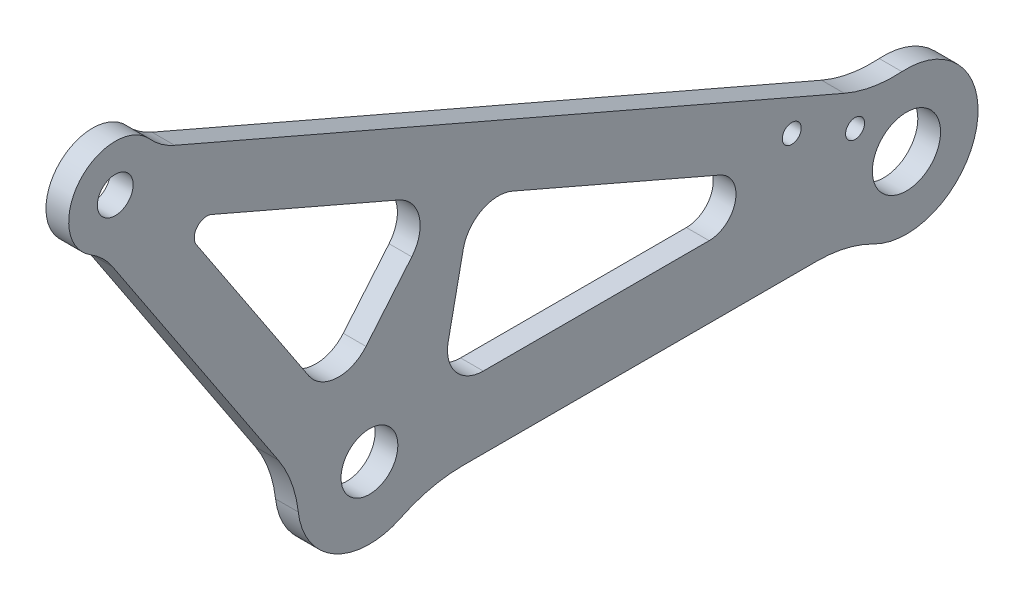
ISO-10303-21;
HEADER;
FILE_DESCRIPTION(('STEP AP214'),'2;1');
FILE_NAME('part.step','',(''),(''),'','','');
FILE_SCHEMA(('AUTOMOTIVE_DESIGN { 1 0 10303 214 1 1 1 1 }'));
ENDSEC;
DATA;
#1=APPLICATION_CONTEXT('core data for automotive mechanical design processes');
#2=APPLICATION_PROTOCOL_DEFINITION('international standard','automotive_design',2000,#1);
#3=PRODUCT_CONTEXT('',#1,'mechanical');
#4=PRODUCT('Part','Part','',(#3));
#5=PRODUCT_RELATED_PRODUCT_CATEGORY('part','',(#4));
#6=PRODUCT_DEFINITION_FORMATION('','',#4);
#7=PRODUCT_DEFINITION_CONTEXT('part definition',#1,'design');
#8=PRODUCT_DEFINITION('design','',#6,#7);
#9=PRODUCT_DEFINITION_SHAPE('','',#8);
#10=(LENGTH_UNIT() NAMED_UNIT(*) SI_UNIT(.MILLI.,.METRE.));
#11=(NAMED_UNIT(*) PLANE_ANGLE_UNIT() SI_UNIT($,.RADIAN.));
#12=(NAMED_UNIT(*) SI_UNIT($,.STERADIAN.) SOLID_ANGLE_UNIT());
#13=UNCERTAINTY_MEASURE_WITH_UNIT(LENGTH_MEASURE(1.E-05),#10,'distance_accuracy_value','');
#14=(GEOMETRIC_REPRESENTATION_CONTEXT(3) GLOBAL_UNCERTAINTY_ASSIGNED_CONTEXT((#13)) GLOBAL_UNIT_ASSIGNED_CONTEXT((#10,
#11,#12)) REPRESENTATION_CONTEXT('',''));
#15=CARTESIAN_POINT('',(0.,0.,0.));
#16=DIRECTION('',(0.,0.,1.));
#17=DIRECTION('',(1.,0.,0.));
#18=AXIS2_PLACEMENT_3D('',#15,#16,#17);
#19=CARTESIAN_POINT('',(6.35,14.,75.));
#20=DIRECTION('',(-1.,0.,0.));
#21=DIRECTION('',(0.,0.,1.));
#22=AXIS2_PLACEMENT_3D('',#19,#20,#21);
#23=CYLINDRICAL_SURFACE('',#22,20.);
#24=CARTESIAN_POINT('',(0.,14.,75.));
#25=DIRECTION('',(1.,0.,0.));
#26=DIRECTION('',(0.,0.,-1.));
#27=AXIS2_PLACEMENT_3D('',#24,#25,#26);
#28=CIRCLE('',#27,20.);
#29=CARTESIAN_POINT('',(0.,11.7382225914099,94.8716975357917));
#30=VERTEX_POINT('',#29);
#31=CARTESIAN_POINT('',(0.,-3.99999999999999,66.2822021129186));
#32=VERTEX_POINT('',#31);
#33=EDGE_CURVE('E286',#30,#32,#28,.T.);
#34=ORIENTED_EDGE('',*,*,#33,.T.);
#35=DIRECTION('',(-1.,0.,0.));
#36=VECTOR('',#35,1.);
#37=CARTESIAN_POINT('',(6.35,-3.99999999999999,66.2822021129186));
#38=LINE('',#37,#36);
#39=CARTESIAN_POINT('',(6.35,-3.99999999999999,66.2822021129186));
#40=VERTEX_POINT('',#39);
#41=EDGE_CURVE('E81',#32,#40,#38,.F.);
#42=ORIENTED_EDGE('',*,*,#41,.T.);
#43=CARTESIAN_POINT('',(6.35,14.,75.));
#44=DIRECTION('',(1.,0.,0.));
#45=DIRECTION('',(0.,0.,-1.));
#46=AXIS2_PLACEMENT_3D('',#43,#44,#45);
#47=CIRCLE('',#46,20.);
#48=CARTESIAN_POINT('',(6.35,11.7382225914099,94.8716975357917));
#49=VERTEX_POINT('',#48);
#50=EDGE_CURVE('E287',#49,#40,#47,.T.);
#51=ORIENTED_EDGE('',*,*,#50,.F.);
#52=DIRECTION('',(-1.,0.,0.));
#53=VECTOR('',#52,1.);
#54=CARTESIAN_POINT('',(6.35,11.7382225914099,94.8716975357917));
#55=LINE('',#54,#53);
#56=EDGE_CURVE('E306',#49,#30,#55,.T.);
#57=ORIENTED_EDGE('',*,*,#56,.T.);
#58=EDGE_LOOP('',(#34,#42,#51,#57));
#59=FACE_BOUND('',#58,.T.);
#60=ADVANCED_FACE('F56',(#59),#23,.T.);
#61=CARTESIAN_POINT('',(6.35,0.,60.7171431429143));
#62=DIRECTION('',(0.,1.,0.));
#63=DIRECTION('',(0.,0.,1.));
#64=AXIS2_PLACEMENT_3D('',#61,#62,#63);
#65=PLANE('',#64);
#66=DIRECTION('',(0.,0.,-1.));
#67=VECTOR('',#66,1.);
#68=CARTESIAN_POINT('',(6.35,0.,60.7171431429143));
#69=LINE('',#68,#67);
#70=CARTESIAN_POINT('',(6.35,0.,48.8466063387559));
#71=VERTEX_POINT('',#70);
#72=CARTESIAN_POINT('',(6.35,0.,-50.0200080064063));
#73=VERTEX_POINT('',#72);
#74=EDGE_CURVE('E291',#71,#73,#69,.T.);
#75=ORIENTED_EDGE('',*,*,#74,.F.);
#76=DIRECTION('',(1.,0.,0.));
#77=VECTOR('',#76,1.);
#78=CARTESIAN_POINT('',(0.,0.,48.8466063387559));
#79=LINE('',#78,#77);
#80=CARTESIAN_POINT('',(0.,0.,48.8466063387559));
#81=VERTEX_POINT('',#80);
#82=EDGE_CURVE('E376',#71,#81,#79,.F.);
#83=ORIENTED_EDGE('',*,*,#82,.T.);
#84=DIRECTION('',(0.,0.,-1.));
#85=VECTOR('',#84,1.);
#86=CARTESIAN_POINT('',(0.,0.,60.7171431429143));
#87=LINE('',#86,#85);
#88=CARTESIAN_POINT('',(0.,0.,-50.0200080064063));
#89=VERTEX_POINT('',#88);
#90=EDGE_CURVE('E674',#81,#89,#87,.T.);
#91=ORIENTED_EDGE('',*,*,#90,.T.);
#92=DIRECTION('',(1.,0.,0.));
#93=VECTOR('',#92,1.);
#94=CARTESIAN_POINT('',(6.35,0.,-50.0200080064063));
#95=LINE('',#94,#93);
#96=EDGE_CURVE('E333',#89,#73,#95,.T.);
#97=ORIENTED_EDGE('',*,*,#96,.T.);
#98=EDGE_LOOP('',(#75,#83,#91,#97));
#99=FACE_BOUND('',#98,.T.);
#100=ADVANCED_FACE('F610',(#99),#65,.F.);
#101=CARTESIAN_POINT('',(6.35,14.,-75.));
#102=DIRECTION('',(-1.,0.,0.));
#103=DIRECTION('',(0.,0.,1.));
#104=AXIS2_PLACEMENT_3D('',#101,#102,#103);
#105=CYLINDRICAL_SURFACE('',#104,20.);
#106=CARTESIAN_POINT('',(0.,14.,-75.));
#107=DIRECTION('',(1.,0.,0.));
#108=DIRECTION('',(0.,0.,-1.));
#109=AXIS2_PLACEMENT_3D('',#106,#107,#108);
#110=CIRCLE('',#109,20.);
#111=CARTESIAN_POINT('',(0.,-3.81818181818182,-65.9163665477841));
#112=VERTEX_POINT('',#111);
#113=CARTESIAN_POINT('',(0.,33.9602946671476,-73.7403822799596));
#114=VERTEX_POINT('',#113);
#115=EDGE_CURVE('E678',#112,#114,#110,.T.);
#116=ORIENTED_EDGE('',*,*,#115,.T.);
#117=DIRECTION('',(-1.,0.,0.));
#118=VECTOR('',#117,1.);
#119=CARTESIAN_POINT('',(6.35,33.9602946671476,-73.7403822799596));
#120=LINE('',#119,#118);
#121=CARTESIAN_POINT('',(6.35,33.9602946671476,-73.7403822799596));
#122=VERTEX_POINT('',#121);
#123=EDGE_CURVE('E330',#114,#122,#120,.F.);
#124=ORIENTED_EDGE('',*,*,#123,.T.);
#125=CARTESIAN_POINT('',(6.35,14.,-75.));
#126=DIRECTION('',(1.,0.,0.));
#127=DIRECTION('',(0.,0.,-1.));
#128=AXIS2_PLACEMENT_3D('',#125,#126,#127);
#129=CIRCLE('',#128,20.);
#130=CARTESIAN_POINT('',(6.35,-3.81818181818182,-65.9163665477841));
#131=VERTEX_POINT('',#130);
#132=EDGE_CURVE('E666',#131,#122,#129,.T.);
#133=ORIENTED_EDGE('',*,*,#132,.F.);
#134=DIRECTION('',(-1.,0.,0.));
#135=VECTOR('',#134,1.);
#136=CARTESIAN_POINT('',(6.35,-3.81818181818182,-65.9163665477841));
#137=LINE('',#136,#135);
#138=EDGE_CURVE('E326',#131,#112,#137,.T.);
#139=ORIENTED_EDGE('',*,*,#138,.T.);
#140=EDGE_LOOP('',(#116,#124,#133,#139));
#141=FACE_BOUND('',#140,.T.);
#142=ADVANCED_FACE('F617',(#141),#105,.T.);
#143=CARTESIAN_POINT('',(6.35,119.878311848488,134.404938559373));
#144=DIRECTION('',(0.,-0.917745162956209,0.39716975699376));
#145=DIRECTION('',(0.,-0.39716975699376,-0.917745162956209));
#146=AXIS2_PLACEMENT_3D('',#143,#144,#145);
#147=PLANE('',#146);
#148=DIRECTION('',(0.,0.39716975699376,0.917745162956209));
#149=VECTOR('',#148,1.);
#150=CARTESIAN_POINT('',(0.,119.878311848488,134.404938559373));
#151=LINE('',#150,#149);
#152=CARTESIAN_POINT('',(0.,36.7697296311885,-57.6351097751074));
#153=VERTEX_POINT('',#152);
#154=CARTESIAN_POINT('',(0.,117.717270204049,129.411392396283));
#155=VERTEX_POINT('',#154);
#156=EDGE_CURVE('E742',#153,#155,#151,.T.);
#157=ORIENTED_EDGE('',*,*,#156,.T.);
#158=DIRECTION('',(1.,0.,0.));
#159=VECTOR('',#158,1.);
#160=CARTESIAN_POINT('',(6.35,117.717270204049,129.411392396283));
#161=LINE('',#160,#159);
#162=CARTESIAN_POINT('',(6.35,117.717270204049,129.411392396283));
#163=VERTEX_POINT('',#162);
#164=EDGE_CURVE('E361',#155,#163,#161,.T.);
#165=ORIENTED_EDGE('',*,*,#164,.T.);
#166=DIRECTION('',(0.,0.39716975699376,0.917745162956209));
#167=VECTOR('',#166,1.);
#168=CARTESIAN_POINT('',(6.35,119.878311848488,134.404938559373));
#169=LINE('',#168,#167);
#170=CARTESIAN_POINT('',(6.35,36.7697296311885,-57.6351097751074));
#171=VERTEX_POINT('',#170);
#172=EDGE_CURVE('E654',#171,#163,#169,.T.);
#173=ORIENTED_EDGE('',*,*,#172,.F.);
#174=DIRECTION('',(1.,0.,0.));
#175=VECTOR('',#174,1.);
#176=CARTESIAN_POINT('',(0.,36.7697296311885,-57.6351097751074));
#177=LINE('',#176,#175);
#178=EDGE_CURVE('E322',#171,#153,#177,.F.);
#179=ORIENTED_EDGE('',*,*,#178,.T.);
#180=EDGE_LOOP('',(#157,#165,#173,#179));
#181=FACE_BOUND('',#180,.T.);
#182=ADVANCED_FACE('F728',(#181),#147,.F.);
#183=CARTESIAN_POINT('',(6.35,114.,146.));
#184=DIRECTION('',(-1.,0.,0.));
#185=DIRECTION('',(0.,0.,1.));
#186=AXIS2_PLACEMENT_3D('',#183,#184,#185);
#187=CYLINDRICAL_SURFACE('',#186,13.);
#188=CARTESIAN_POINT('',(0.,114.,146.));
#189=DIRECTION('',(1.,0.,0.));
#190=DIRECTION('',(0.,0.,-1.));
#191=AXIS2_PLACEMENT_3D('',#188,#189,#190);
#192=CIRCLE('',#191,13.);
#193=CARTESIAN_POINT('',(0.,122.695098637007,136.33587770707));
#194=VERTEX_POINT('',#193);
#195=CARTESIAN_POINT('',(0.,102.960290459899,152.864751508263));
#196=VERTEX_POINT('',#195);
#197=EDGE_CURVE('E304',#194,#196,#192,.T.);
#198=ORIENTED_EDGE('',*,*,#197,.T.);
#199=DIRECTION('',(-1.,0.,0.));
#200=VECTOR('',#199,1.);
#201=CARTESIAN_POINT('',(6.35,102.960290459899,152.864751508263));
#202=LINE('',#201,#200);
#203=CARTESIAN_POINT('',(6.35,102.960290459899,152.864751508263));
#204=VERTEX_POINT('',#203);
#205=EDGE_CURVE('E358',#196,#204,#202,.F.);
#206=ORIENTED_EDGE('',*,*,#205,.T.);
#207=CARTESIAN_POINT('',(6.35,114.,146.));
#208=DIRECTION('',(1.,0.,0.));
#209=DIRECTION('',(0.,0.,-1.));
#210=AXIS2_PLACEMENT_3D('',#207,#208,#209);
#211=CIRCLE('',#210,13.);
#212=CARTESIAN_POINT('',(6.35,122.695098637007,136.33587770707));
#213=VERTEX_POINT('',#212);
#214=EDGE_CURVE('E651',#213,#204,#211,.T.);
#215=ORIENTED_EDGE('',*,*,#214,.F.);
#216=DIRECTION('',(-1.,0.,0.));
#217=VECTOR('',#216,1.);
#218=CARTESIAN_POINT('',(6.35,122.695098637007,136.33587770707));
#219=LINE('',#218,#217);
#220=EDGE_CURVE('E354',#213,#194,#219,.T.);
#221=ORIENTED_EDGE('',*,*,#220,.T.);
#222=EDGE_LOOP('',(#198,#206,#215,#221));
#223=FACE_BOUND('',#222,.T.);
#224=ADVANCED_FACE('F657',(#223),#187,.T.);
#225=CARTESIAN_POINT('',(6.35,101.553480850632,149.752887030597));
#226=DIRECTION('',(0.,0.552019943967369,-0.833830906996294));
#227=DIRECTION('',(0.,0.833830906996294,0.552019943967369));
#228=AXIS2_PLACEMENT_3D('',#225,#226,#227);
#229=PLANE('',#228);
#230=DIRECTION('',(0.,-0.833830906996294,-0.552019943967369));
#231=VECTOR('',#230,1.);
#232=CARTESIAN_POINT('',(6.35,101.553480850632,149.752887030597));
#233=LINE('',#232,#231);
#234=CARTESIAN_POINT('',(6.35,97.0165208160136,146.749289534896));
#235=VERTEX_POINT('',#234);
#236=CARTESIAN_POINT('',(6.35,27.1008101652352,100.463086478557));
#237=VERTEX_POINT('',#236);
#238=EDGE_CURVE('E311',#235,#237,#233,.T.);
#239=ORIENTED_EDGE('',*,*,#238,.F.);
#240=DIRECTION('',(1.,0.,0.));
#241=VECTOR('',#240,1.);
#242=CARTESIAN_POINT('',(0.,97.0165208160136,146.749289534896));
#243=LINE('',#242,#241);
#244=CARTESIAN_POINT('',(0.,97.0165208160136,146.749289534896));
#245=VERTEX_POINT('',#244);
#246=EDGE_CURVE('E350',#235,#245,#243,.F.);
#247=ORIENTED_EDGE('',*,*,#246,.T.);
#248=DIRECTION('',(0.,-0.833830906996294,-0.552019943967369));
#249=VECTOR('',#248,1.);
#250=CARTESIAN_POINT('',(0.,101.553480850632,149.752887030597));
#251=LINE('',#250,#249);
#252=CARTESIAN_POINT('',(0.,27.1008101652352,100.463086478557));
#253=VERTEX_POINT('',#252);
#254=EDGE_CURVE('E292',#245,#253,#251,.T.);
#255=ORIENTED_EDGE('',*,*,#254,.T.);
#256=DIRECTION('',(1.,0.,0.));
#257=VECTOR('',#256,1.);
#258=CARTESIAN_POINT('',(6.35,27.1008101652352,100.463086478557));
#259=LINE('',#258,#257);
#260=EDGE_CURVE('E310',#253,#237,#259,.T.);
#261=ORIENTED_EDGE('',*,*,#260,.T.);
#262=EDGE_LOOP('',(#239,#247,#255,#261));
#263=FACE_BOUND('',#262,.T.);
#264=ADVANCED_FACE('F718',(#263),#229,.F.);
#265=CARTESIAN_POINT('',(6.35,14.,75.));
#266=DIRECTION('',(1.,0.,0.));
#267=DIRECTION('',(0.,0.,-1.));
#268=AXIS2_PLACEMENT_3D('',#265,#266,#267);
#269=PLANE('',#268);
#270=CARTESIAN_POINT('',(6.35,34.4007902462945,-42.9665272972412));
#271=DIRECTION('',(1.,0.,0.));
#272=DIRECTION('',(0.,0.,-1.));
#273=AXIS2_PLACEMENT_3D('',#270,#271,#272);
#274=CIRCLE('',#273,2.65);
#275=CARTESIAN_POINT('',(6.35,34.4007902462945,-45.6165272972412));
#276=VERTEX_POINT('',#275);
#277=EDGE_CURVE('E402',#276,#276,#274,.T.);
#278=ORIENTED_EDGE('',*,*,#277,.F.);
#279=EDGE_LOOP('',(#278));
#280=FACE_BOUND('',#279,.T.);
#281=CARTESIAN_POINT('',(6.35,26.7502274746188,-60.6447791126444));
#282=DIRECTION('',(1.,0.,0.));
#283=DIRECTION('',(0.,0.,-1.));
#284=AXIS2_PLACEMENT_3D('',#281,#282,#283);
#285=CIRCLE('',#284,2.65000000000001);
#286=CARTESIAN_POINT('',(6.35,26.7502274746188,-63.2947791126444));
#287=VERTEX_POINT('',#286);
#288=EDGE_CURVE('E388',#287,#287,#285,.T.);
#289=ORIENTED_EDGE('',*,*,#288,.F.);
#290=EDGE_LOOP('',(#289));
#291=FACE_BOUND('',#290,.T.);
#292=CARTESIAN_POINT('',(6.35,30.,43.1954781826125));
#293=DIRECTION('',(1.,0.,0.));
#294=DIRECTION('',(0.,0.,-1.));
#295=AXIS2_PLACEMENT_3D('',#292,#293,#294);
#296=CIRCLE('',#295,10.);
#297=CARTESIAN_POINT('',(6.35,32.0279896085014,52.9876821300296));
#298=VERTEX_POINT('',#297);
#299=CARTESIAN_POINT('',(6.35,20.,43.1954781826125));
#300=VERTEX_POINT('',#299);
#301=EDGE_CURVE('E228',#298,#300,#296,.T.);
#302=ORIENTED_EDGE('',*,*,#301,.F.);
#303=DIRECTION('',(0.,-0.979220394741707,0.202798960850138));
#304=VECTOR('',#303,1.);
#305=CARTESIAN_POINT('',(6.35,32.0279896085014,52.9876821300296));
#306=LINE('',#305,#304);
#307=CARTESIAN_POINT('',(6.35,52.2877363487515,48.7918385711406));
#308=VERTEX_POINT('',#307);
#309=EDGE_CURVE('E234',#308,#298,#306,.T.);
#310=ORIENTED_EDGE('',*,*,#309,.F.);
#311=CARTESIAN_POINT('',(6.35,50.2597467402501,38.9996346237235));
#312=DIRECTION('',(1.,0.,0.));
#313=DIRECTION('',(0.,0.,1.));
#314=AXIS2_PLACEMENT_3D('',#311,#312,#313);
#315=CIRCLE('',#314,10.);
#316=CARTESIAN_POINT('',(6.35,59.4371983698122,35.0279370537859));
#317=VERTEX_POINT('',#316);
#318=EDGE_CURVE('E484',#317,#308,#315,.T.);
#319=ORIENTED_EDGE('',*,*,#318,.F.);
#320=DIRECTION('',(0.,0.39716975699376,0.917745162956209));
#321=VECTOR('',#320,1.);
#322=CARTESIAN_POINT('',(6.35,59.4371983698122,35.0279370537859));
#323=LINE('',#322,#321);
#324=CARTESIAN_POINT('',(6.35,34.3830887221716,-22.8649098621939));
#325=VERTEX_POINT('',#324);
#326=EDGE_CURVE('E429',#325,#317,#323,.T.);
#327=ORIENTED_EDGE('',*,*,#326,.F.);
#328=CARTESIAN_POINT('',(6.35,27.5000000000001,-19.8861366847402));
#329=DIRECTION('',(1.,0.,0.));
#330=DIRECTION('',(0.,0.,-1.));
#331=AXIS2_PLACEMENT_3D('',#328,#329,#330);
#332=CIRCLE('',#331,7.50000000000012);
#333=CARTESIAN_POINT('',(6.35,20.,-19.8861366847407));
#334=VERTEX_POINT('',#333);
#335=EDGE_CURVE('E478',#334,#325,#332,.T.);
#336=ORIENTED_EDGE('',*,*,#335,.F.);
#337=DIRECTION('',(0.,0.,-1.));
#338=VECTOR('',#337,1.);
#339=CARTESIAN_POINT('',(6.35,20.,-19.8861366847407));
#340=LINE('',#339,#338);
#341=EDGE_CURVE('E256',#300,#334,#340,.T.);
#342=ORIENTED_EDGE('',*,*,#341,.F.);
#343=EDGE_LOOP('',(#302,#310,#319,#327,#336,#342));
#344=FACE_BOUND('',#343,.T.);
#345=CARTESIAN_POINT('',(6.35,92.581437501733,120.427100877121));
#346=DIRECTION('',(1.,0.,0.));
#347=DIRECTION('',(0.,0.,-1.));
#348=AXIS2_PLACEMENT_3D('',#345,#346,#347);
#349=CIRCLE('',#348,3.49999999999999);
#350=CARTESIAN_POINT('',(6.35,95.7935455720797,119.037006727643));
#351=VERTEX_POINT('',#350);
#352=CARTESIAN_POINT('',(6.35,90.6493676978472,123.345509051608));
#353=VERTEX_POINT('',#352);
#354=EDGE_CURVE('E540',#351,#353,#349,.T.);
#355=ORIENTED_EDGE('',*,*,#354,.F.);
#356=DIRECTION('',(0.,0.397169756993759,0.917745162956209));
#357=VECTOR('',#356,1.);
#358=CARTESIAN_POINT('',(6.35,95.7935455720797,119.037006727643));
#359=LINE('',#358,#357);
#360=CARTESIAN_POINT('',(6.35,73.2135031032277,66.8610180219863));
#361=VERTEX_POINT('',#360);
#362=EDGE_CURVE('E446',#361,#351,#359,.T.);
#363=ORIENTED_EDGE('',*,*,#362,.F.);
#364=CARTESIAN_POINT('',(6.35,64.0360514736656,70.8327155919239));
#365=DIRECTION('',(1.,0.,0.));
#366=DIRECTION('',(0.,0.,-1.));
#367=AXIS2_PLACEMENT_3D('',#364,#365,#366);
#368=CIRCLE('',#367,10.);
#369=CARTESIAN_POINT('',(6.35,57.6151528400077,63.1664217848558));
#370=VERTEX_POINT('',#369);
#371=EDGE_CURVE('E464',#370,#361,#368,.T.);
#372=ORIENTED_EDGE('',*,*,#371,.F.);
#373=DIRECTION('',(0.,0.766629380706807,-0.642089863365789));
#374=VECTOR('',#373,1.);
#375=CARTESIAN_POINT('',(6.35,42.3434042301445,75.9572633897303));
#376=LINE('',#375,#374);
#377=CARTESIAN_POINT('',(6.35,42.3434042301445,75.9572633897303));
#378=VERTEX_POINT('',#377);
#379=EDGE_CURVE('E468',#378,#370,#376,.T.);
#380=ORIENTED_EDGE('',*,*,#379,.F.);
#381=CARTESIAN_POINT('',(6.35,48.7643028638024,83.6235571967984));
#382=DIRECTION('',(1.,0.,0.));
#383=DIRECTION('',(0.,0.,1.));
#384=AXIS2_PLACEMENT_3D('',#381,#382,#383);
#385=CIRCLE('',#384,10.);
#386=CARTESIAN_POINT('',(6.35,43.2441034241287,91.9618662667613));
#387=VERTEX_POINT('',#386);
#388=EDGE_CURVE('E473',#387,#378,#385,.T.);
#389=ORIENTED_EDGE('',*,*,#388,.F.);
#390=DIRECTION('',(0.,-0.833830906996294,-0.552019943967369));
#391=VECTOR('',#390,1.);
#392=CARTESIAN_POINT('',(6.35,90.6493676978472,123.345509051608));
#393=LINE('',#392,#391);
#394=EDGE_CURVE('E545',#353,#387,#393,.T.);
#395=ORIENTED_EDGE('',*,*,#394,.F.);
#396=EDGE_LOOP('',(#355,#363,#372,#380,#389,#395));
#397=FACE_BOUND('',#396,.T.);
#398=CARTESIAN_POINT('',(6.35,14.,75.));
#399=DIRECTION('',(1.,0.,0.));
#400=DIRECTION('',(0.,0.,-1.));
#401=AXIS2_PLACEMENT_3D('',#398,#399,#400);
#402=CIRCLE('',#401,7.9375);
#403=CARTESIAN_POINT('',(6.35,14.,67.0625));
#404=VERTEX_POINT('',#403);
#405=EDGE_CURVE('E243',#404,#404,#402,.T.);
#406=ORIENTED_EDGE('',*,*,#405,.F.);
#407=EDGE_LOOP('',(#406));
#408=FACE_BOUND('',#407,.T.);
#409=CARTESIAN_POINT('',(6.35,114.,146.));
#410=DIRECTION('',(1.,0.,0.));
#411=DIRECTION('',(0.,0.,-1.));
#412=AXIS2_PLACEMENT_3D('',#409,#410,#411);
#413=CIRCLE('',#412,5.);
#414=CARTESIAN_POINT('',(6.35,114.,141.));
#415=VERTEX_POINT('',#414);
#416=EDGE_CURVE('E689',#415,#415,#413,.T.);
#417=ORIENTED_EDGE('',*,*,#416,.F.);
#418=EDGE_LOOP('',(#417));
#419=FACE_BOUND('',#418,.T.);
#420=CARTESIAN_POINT('',(6.35,14.,-75.));
#421=DIRECTION('',(1.,0.,0.));
#422=DIRECTION('',(0.,0.,-1.));
#423=AXIS2_PLACEMENT_3D('',#420,#421,#422);
#424=CIRCLE('',#423,9.52499999999999);
#425=CARTESIAN_POINT('',(6.35,14.,-84.525));
#426=VERTEX_POINT('',#425);
#427=EDGE_CURVE('E274',#426,#426,#424,.T.);
#428=ORIENTED_EDGE('',*,*,#427,.F.);
#429=EDGE_LOOP('',(#428));
#430=FACE_BOUND('',#429,.T.);
#431=ORIENTED_EDGE('',*,*,#214,.T.);
#432=CARTESIAN_POINT('',(6.35,85.9761219366663,163.425907674821));
#433=DIRECTION('',(1.,0.,0.));
#434=DIRECTION('',(0.,0.,-1.));
#435=AXIS2_PLACEMENT_3D('',#432,#433,#434);
#436=CIRCLE('',#435,20.);
#437=EDGE_CURVE('E367',#204,#235,#436,.F.);
#438=ORIENTED_EDGE('',*,*,#437,.T.);
#439=ORIENTED_EDGE('',*,*,#238,.T.);
#440=CARTESIAN_POINT('',(6.35,7.78011212637733,129.647168223427));
#441=DIRECTION('',(1.,0.,0.));
#442=DIRECTION('',(0.,0.,-1.));
#443=AXIS2_PLACEMENT_3D('',#440,#441,#442);
#444=CIRCLE('',#443,35.);
#445=EDGE_CURVE('E319',#237,#49,#444,.F.);
#446=ORIENTED_EDGE('',*,*,#445,.T.);
#447=ORIENTED_EDGE('',*,*,#50,.T.);
#448=CARTESIAN_POINT('',(6.35,-40.,48.8466063387559));
#449=DIRECTION('',(1.,0.,0.));
#450=DIRECTION('',(0.,0.,-1.));
#451=AXIS2_PLACEMENT_3D('',#448,#449,#450);
#452=CIRCLE('',#451,40.);
#453=EDGE_CURVE('E12',#40,#71,#452,.F.);
#454=ORIENTED_EDGE('',*,*,#453,.T.);
#455=ORIENTED_EDGE('',*,*,#74,.T.);
#456=CARTESIAN_POINT('',(6.35,-35.,-50.0200080064063));
#457=DIRECTION('',(1.,0.,0.));
#458=DIRECTION('',(0.,0.,-1.));
#459=AXIS2_PLACEMENT_3D('',#456,#457,#458);
#460=CIRCLE('',#459,35.);
#461=EDGE_CURVE('E347',#73,#131,#460,.F.);
#462=ORIENTED_EDGE('',*,*,#461,.T.);
#463=ORIENTED_EDGE('',*,*,#132,.T.);
#464=CARTESIAN_POINT('',(6.35,68.8908103346559,-71.5360512698889));
#465=DIRECTION('',(1.,0.,0.));
#466=DIRECTION('',(0.,0.,-1.));
#467=AXIS2_PLACEMENT_3D('',#464,#465,#466);
#468=CIRCLE('',#467,35.);
#469=EDGE_CURVE('E340',#122,#171,#468,.F.);
#470=ORIENTED_EDGE('',*,*,#469,.T.);
#471=ORIENTED_EDGE('',*,*,#172,.T.);
#472=CARTESIAN_POINT('',(6.35,136.072173463173,121.467997256408));
#473=DIRECTION('',(1.,0.,0.));
#474=DIRECTION('',(0.,0.,-1.));
#475=AXIS2_PLACEMENT_3D('',#472,#473,#474);
#476=CIRCLE('',#475,20.);
#477=EDGE_CURVE('E373',#163,#213,#476,.F.);
#478=ORIENTED_EDGE('',*,*,#477,.T.);
#479=EDGE_LOOP('',(#431,#438,#439,#446,#447,#454,#455,#462,#463,#470,#471,#478));
#480=FACE_BOUND('',#479,.T.);
#481=ADVANCED_FACE('F495',(#280,#291,#344,#397,#408,#419,#430,#480),#269,.T.);
#482=CARTESIAN_POINT('',(0.,14.,75.));
#483=DIRECTION('',(1.,0.,0.));
#484=DIRECTION('',(0.,0.,-1.));
#485=AXIS2_PLACEMENT_3D('',#482,#483,#484);
#486=PLANE('',#485);
#487=CARTESIAN_POINT('',(0.,34.4007902462945,-42.9665272972412));
#488=DIRECTION('',(1.,0.,0.));
#489=DIRECTION('',(0.,0.,-1.));
#490=AXIS2_PLACEMENT_3D('',#487,#488,#489);
#491=CIRCLE('',#490,2.65);
#492=CARTESIAN_POINT('',(0.,34.4007902462945,-45.6165272972412));
#493=VERTEX_POINT('',#492);
#494=EDGE_CURVE('E60',#493,#493,#491,.T.);
#495=ORIENTED_EDGE('',*,*,#494,.T.);
#496=EDGE_LOOP('',(#495));
#497=FACE_BOUND('',#496,.T.);
#498=CARTESIAN_POINT('',(0.,26.7502274746188,-60.6447791126444));
#499=DIRECTION('',(1.,0.,0.));
#500=DIRECTION('',(0.,0.,-1.));
#501=AXIS2_PLACEMENT_3D('',#498,#499,#500);
#502=CIRCLE('',#501,2.65000000000001);
#503=CARTESIAN_POINT('',(0.,26.7502274746188,-63.2947791126444));
#504=VERTEX_POINT('',#503);
#505=EDGE_CURVE('E383',#504,#504,#502,.T.);
#506=ORIENTED_EDGE('',*,*,#505,.T.);
#507=EDGE_LOOP('',(#506));
#508=FACE_BOUND('',#507,.T.);
#509=DIRECTION('',(0.,0.979220394741707,-0.202798960850138));
#510=VECTOR('',#509,1.);
#511=CARTESIAN_POINT('',(0.,32.0279896085014,52.9876821300296));
#512=LINE('',#511,#510);
#513=CARTESIAN_POINT('',(0.,32.0279896085014,52.9876821300296));
#514=VERTEX_POINT('',#513);
#515=CARTESIAN_POINT('',(0.,52.2877363487515,48.7918385711406));
#516=VERTEX_POINT('',#515);
#517=EDGE_CURVE('E250',#514,#516,#512,.T.);
#518=ORIENTED_EDGE('',*,*,#517,.F.);
#519=CARTESIAN_POINT('',(0.,30.,43.1954781826125));
#520=DIRECTION('',(1.,0.,0.));
#521=DIRECTION('',(0.,0.,-1.));
#522=AXIS2_PLACEMENT_3D('',#519,#520,#521);
#523=CIRCLE('',#522,10.);
#524=CARTESIAN_POINT('',(0.,20.,43.1954781826125));
#525=VERTEX_POINT('',#524);
#526=EDGE_CURVE('E225',#525,#514,#523,.F.);
#527=ORIENTED_EDGE('',*,*,#526,.F.);
#528=DIRECTION('',(0.,0.,1.));
#529=VECTOR('',#528,1.);
#530=CARTESIAN_POINT('',(0.,20.,-19.8861366847407));
#531=LINE('',#530,#529);
#532=CARTESIAN_POINT('',(0.,20.,-19.8861366847407));
#533=VERTEX_POINT('',#532);
#534=EDGE_CURVE('E238',#533,#525,#531,.T.);
#535=ORIENTED_EDGE('',*,*,#534,.F.);
#536=CARTESIAN_POINT('',(0.,27.5000000000001,-19.8861366847402));
#537=DIRECTION('',(1.,0.,0.));
#538=DIRECTION('',(0.,0.,-1.));
#539=AXIS2_PLACEMENT_3D('',#536,#537,#538);
#540=CIRCLE('',#539,7.50000000000012);
#541=CARTESIAN_POINT('',(0.,34.3830887221716,-22.8649098621939));
#542=VERTEX_POINT('',#541);
#543=EDGE_CURVE('E407',#542,#533,#540,.F.);
#544=ORIENTED_EDGE('',*,*,#543,.F.);
#545=DIRECTION('',(0.,-0.39716975699376,-0.917745162956209));
#546=VECTOR('',#545,1.);
#547=CARTESIAN_POINT('',(0.,59.4371983698122,35.0279370537859));
#548=LINE('',#547,#546);
#549=CARTESIAN_POINT('',(0.,59.4371983698122,35.0279370537859));
#550=VERTEX_POINT('',#549);
#551=EDGE_CURVE('E410',#550,#542,#548,.T.);
#552=ORIENTED_EDGE('',*,*,#551,.F.);
#553=CARTESIAN_POINT('',(0.,50.2597467402501,38.9996346237235));
#554=DIRECTION('',(1.,0.,0.));
#555=DIRECTION('',(0.,0.,-1.));
#556=AXIS2_PLACEMENT_3D('',#553,#554,#555);
#557=CIRCLE('',#556,10.);
#558=EDGE_CURVE('E258',#516,#550,#557,.F.);
#559=ORIENTED_EDGE('',*,*,#558,.F.);
#560=EDGE_LOOP('',(#518,#527,#535,#544,#552,#559));
#561=FACE_BOUND('',#560,.T.);
#562=DIRECTION('',(0.,-0.397169756993759,-0.917745162956209));
#563=VECTOR('',#562,1.);
#564=CARTESIAN_POINT('',(0.,95.7935455720797,119.037006727643));
#565=LINE('',#564,#563);
#566=CARTESIAN_POINT('',(0.,95.7935455720797,119.037006727643));
#567=VERTEX_POINT('',#566);
#568=CARTESIAN_POINT('',(0.,73.2135031032277,66.8610180219863));
#569=VERTEX_POINT('',#568);
#570=EDGE_CURVE('E528',#567,#569,#565,.T.);
#571=ORIENTED_EDGE('',*,*,#570,.F.);
#572=CARTESIAN_POINT('',(0.,92.581437501733,120.427100877121));
#573=DIRECTION('',(1.,0.,0.));
#574=DIRECTION('',(0.,0.,-1.));
#575=AXIS2_PLACEMENT_3D('',#572,#573,#574);
#576=CIRCLE('',#575,3.49999999999999);
#577=CARTESIAN_POINT('',(0.,90.6493676978472,123.345509051608));
#578=VERTEX_POINT('',#577);
#579=EDGE_CURVE('E534',#578,#567,#576,.F.);
#580=ORIENTED_EDGE('',*,*,#579,.F.);
#581=DIRECTION('',(0.,0.833830906996294,0.552019943967369));
#582=VECTOR('',#581,1.);
#583=CARTESIAN_POINT('',(0.,90.6493676978472,123.345509051608));
#584=LINE('',#583,#582);
#585=CARTESIAN_POINT('',(0.,43.2441034241287,91.9618662667613));
#586=VERTEX_POINT('',#585);
#587=EDGE_CURVE('E387',#586,#578,#584,.T.);
#588=ORIENTED_EDGE('',*,*,#587,.F.);
#589=CARTESIAN_POINT('',(0.,48.7643028638024,83.6235571967984));
#590=DIRECTION('',(1.,0.,0.));
#591=DIRECTION('',(0.,0.,-1.));
#592=AXIS2_PLACEMENT_3D('',#589,#590,#591);
#593=CIRCLE('',#592,10.);
#594=CARTESIAN_POINT('',(0.,42.3434042301445,75.9572633897303));
#595=VERTEX_POINT('',#594);
#596=EDGE_CURVE('E411',#595,#586,#593,.F.);
#597=ORIENTED_EDGE('',*,*,#596,.F.);
#598=DIRECTION('',(0.,-0.766629380706807,0.642089863365789));
#599=VECTOR('',#598,1.);
#600=CARTESIAN_POINT('',(0.,42.3434042301445,75.9572633897303));
#601=LINE('',#600,#599);
#602=CARTESIAN_POINT('',(0.,57.6151528400077,63.1664217848558));
#603=VERTEX_POINT('',#602);
#604=EDGE_CURVE('E516',#603,#595,#601,.T.);
#605=ORIENTED_EDGE('',*,*,#604,.F.);
#606=CARTESIAN_POINT('',(0.,64.0360514736656,70.8327155919239));
#607=DIRECTION('',(1.,0.,0.));
#608=DIRECTION('',(0.,0.,-1.));
#609=AXIS2_PLACEMENT_3D('',#606,#607,#608);
#610=CIRCLE('',#609,10.);
#611=EDGE_CURVE('E522',#569,#603,#610,.F.);
#612=ORIENTED_EDGE('',*,*,#611,.F.);
#613=EDGE_LOOP('',(#571,#580,#588,#597,#605,#612));
#614=FACE_BOUND('',#613,.T.);
#615=CARTESIAN_POINT('',(0.,14.,75.));
#616=DIRECTION('',(1.,0.,0.));
#617=DIRECTION('',(0.,0.,-1.));
#618=AXIS2_PLACEMENT_3D('',#615,#616,#617);
#619=CIRCLE('',#618,7.9375);
#620=CARTESIAN_POINT('',(0.,14.,67.0625));
#621=VERTEX_POINT('',#620);
#622=EDGE_CURVE('E686',#621,#621,#619,.T.);
#623=ORIENTED_EDGE('',*,*,#622,.T.);
#624=EDGE_LOOP('',(#623));
#625=FACE_BOUND('',#624,.T.);
#626=CARTESIAN_POINT('',(0.,114.,146.));
#627=DIRECTION('',(1.,0.,0.));
#628=DIRECTION('',(0.,0.,-1.));
#629=AXIS2_PLACEMENT_3D('',#626,#627,#628);
#630=CIRCLE('',#629,5.);
#631=CARTESIAN_POINT('',(0.,114.,141.));
#632=VERTEX_POINT('',#631);
#633=EDGE_CURVE('E280',#632,#632,#630,.T.);
#634=ORIENTED_EDGE('',*,*,#633,.T.);
#635=EDGE_LOOP('',(#634));
#636=FACE_BOUND('',#635,.T.);
#637=CARTESIAN_POINT('',(0.,14.,-75.));
#638=DIRECTION('',(1.,0.,0.));
#639=DIRECTION('',(0.,0.,-1.));
#640=AXIS2_PLACEMENT_3D('',#637,#638,#639);
#641=CIRCLE('',#640,9.52499999999999);
#642=CARTESIAN_POINT('',(0.,14.,-84.525));
#643=VERTEX_POINT('',#642);
#644=EDGE_CURVE('E279',#643,#643,#641,.T.);
#645=ORIENTED_EDGE('',*,*,#644,.T.);
#646=EDGE_LOOP('',(#645));
#647=FACE_BOUND('',#646,.T.);
#648=ORIENTED_EDGE('',*,*,#33,.F.);
#649=CARTESIAN_POINT('',(0.,7.78011212637733,129.647168223427));
#650=DIRECTION('',(1.,0.,0.));
#651=DIRECTION('',(0.,0.,-1.));
#652=AXIS2_PLACEMENT_3D('',#649,#650,#651);
#653=CIRCLE('',#652,35.);
#654=EDGE_CURVE('E315',#30,#253,#653,.T.);
#655=ORIENTED_EDGE('',*,*,#654,.T.);
#656=ORIENTED_EDGE('',*,*,#254,.F.);
#657=CARTESIAN_POINT('',(0.,85.9761219366663,163.425907674821));
#658=DIRECTION('',(1.,0.,0.));
#659=DIRECTION('',(0.,0.,-1.));
#660=AXIS2_PLACEMENT_3D('',#657,#658,#659);
#661=CIRCLE('',#660,20.);
#662=EDGE_CURVE('E364',#245,#196,#661,.T.);
#663=ORIENTED_EDGE('',*,*,#662,.T.);
#664=ORIENTED_EDGE('',*,*,#197,.F.);
#665=CARTESIAN_POINT('',(0.,136.072173463173,121.467997256408));
#666=DIRECTION('',(1.,0.,0.));
#667=DIRECTION('',(0.,0.,-1.));
#668=AXIS2_PLACEMENT_3D('',#665,#666,#667);
#669=CIRCLE('',#668,20.);
#670=EDGE_CURVE('E370',#194,#155,#669,.T.);
#671=ORIENTED_EDGE('',*,*,#670,.T.);
#672=ORIENTED_EDGE('',*,*,#156,.F.);
#673=CARTESIAN_POINT('',(0.,68.8908103346559,-71.5360512698889));
#674=DIRECTION('',(1.,0.,0.));
#675=DIRECTION('',(0.,0.,-1.));
#676=AXIS2_PLACEMENT_3D('',#673,#674,#675);
#677=CIRCLE('',#676,35.);
#678=EDGE_CURVE('E337',#153,#114,#677,.T.);
#679=ORIENTED_EDGE('',*,*,#678,.T.);
#680=ORIENTED_EDGE('',*,*,#115,.F.);
#681=CARTESIAN_POINT('',(0.,-35.,-50.0200080064063));
#682=DIRECTION('',(1.,0.,0.));
#683=DIRECTION('',(0.,0.,-1.));
#684=AXIS2_PLACEMENT_3D('',#681,#682,#683);
#685=CIRCLE('',#684,35.);
#686=EDGE_CURVE('E343',#112,#89,#685,.T.);
#687=ORIENTED_EDGE('',*,*,#686,.T.);
#688=ORIENTED_EDGE('',*,*,#90,.F.);
#689=CARTESIAN_POINT('',(0.,-40.,48.8466063387559));
#690=DIRECTION('',(1.,0.,0.));
#691=DIRECTION('',(0.,0.,-1.));
#692=AXIS2_PLACEMENT_3D('',#689,#690,#691);
#693=CIRCLE('',#692,40.);
#694=EDGE_CURVE('E67',#81,#32,#693,.T.);
#695=ORIENTED_EDGE('',*,*,#694,.T.);
#696=EDGE_LOOP('',(#648,#655,#656,#663,#664,#671,#672,#679,#680,#687,#688,#695));
#697=FACE_BOUND('',#696,.T.);
#698=ADVANCED_FACE('F246',(#497,#508,#561,#614,#625,#636,#647,#697),#486,.F.);
#699=CARTESIAN_POINT('',(6.35,14.,-75.));
#700=DIRECTION('',(1.,0.,0.));
#701=DIRECTION('',(0.,0.,-1.));
#702=AXIS2_PLACEMENT_3D('',#699,#700,#701);
#703=CYLINDRICAL_SURFACE('',#702,9.52499999999999);
#704=ORIENTED_EDGE('',*,*,#644,.F.);
#705=EDGE_LOOP('',(#704));
#706=FACE_BOUND('',#705,.T.);
#707=ORIENTED_EDGE('',*,*,#427,.T.);
#708=EDGE_LOOP('',(#707));
#709=FACE_BOUND('',#708,.T.);
#710=ADVANCED_FACE('F705',(#706,#709),#703,.F.);
#711=CARTESIAN_POINT('',(6.35,114.,146.));
#712=DIRECTION('',(1.,0.,0.));
#713=DIRECTION('',(0.,0.,-1.));
#714=AXIS2_PLACEMENT_3D('',#711,#712,#713);
#715=CYLINDRICAL_SURFACE('',#714,5.);
#716=ORIENTED_EDGE('',*,*,#633,.F.);
#717=EDGE_LOOP('',(#716));
#718=FACE_BOUND('',#717,.T.);
#719=ORIENTED_EDGE('',*,*,#416,.T.);
#720=EDGE_LOOP('',(#719));
#721=FACE_BOUND('',#720,.T.);
#722=ADVANCED_FACE('F702',(#718,#721),#715,.F.);
#723=CARTESIAN_POINT('',(6.35,14.,75.));
#724=DIRECTION('',(1.,0.,0.));
#725=DIRECTION('',(0.,0.,-1.));
#726=AXIS2_PLACEMENT_3D('',#723,#724,#725);
#727=CYLINDRICAL_SURFACE('',#726,7.9375);
#728=ORIENTED_EDGE('',*,*,#622,.F.);
#729=EDGE_LOOP('',(#728));
#730=FACE_BOUND('',#729,.T.);
#731=ORIENTED_EDGE('',*,*,#405,.T.);
#732=EDGE_LOOP('',(#731));
#733=FACE_BOUND('',#732,.T.);
#734=ADVANCED_FACE('F704',(#730,#733),#727,.F.);
#735=CARTESIAN_POINT('',(-0.00100000000000013,92.581437501733,120.427100877121));
#736=DIRECTION('',(1.,0.,0.));
#737=DIRECTION('',(0.,0.,-1.));
#738=AXIS2_PLACEMENT_3D('',#735,#736,#737);
#739=CYLINDRICAL_SURFACE('',#738,3.49999999999999);
#740=ORIENTED_EDGE('',*,*,#579,.T.);
#741=DIRECTION('',(1.,0.,0.));
#742=VECTOR('',#741,1.);
#743=CARTESIAN_POINT('',(-0.00100000000000013,95.7935455720797,119.037006727643));
#744=LINE('',#743,#742);
#745=EDGE_CURVE('E394',#567,#351,#744,.T.);
#746=ORIENTED_EDGE('',*,*,#745,.T.);
#747=ORIENTED_EDGE('',*,*,#354,.T.);
#748=DIRECTION('',(1.,0.,0.));
#749=VECTOR('',#748,1.);
#750=CARTESIAN_POINT('',(-0.00100000000000013,90.6493676978472,123.345509051608));
#751=LINE('',#750,#749);
#752=EDGE_CURVE('E442',#578,#353,#751,.T.);
#753=ORIENTED_EDGE('',*,*,#752,.F.);
#754=EDGE_LOOP('',(#740,#746,#747,#753));
#755=FACE_BOUND('',#754,.T.);
#756=ADVANCED_FACE('F596',(#755),#739,.F.);
#757=CARTESIAN_POINT('',(-0.00100000000000013,95.7935455720797,119.037006727643));
#758=DIRECTION('',(0.,0.917745162956209,-0.397169756993759));
#759=DIRECTION('',(0.,0.397169756993759,0.917745162956209));
#760=AXIS2_PLACEMENT_3D('',#757,#758,#759);
#761=PLANE('',#760);
#762=ORIENTED_EDGE('',*,*,#570,.T.);
#763=DIRECTION('',(1.,0.,0.));
#764=VECTOR('',#763,1.);
#765=CARTESIAN_POINT('',(-0.00100000000000013,73.2135031032277,66.8610180219863));
#766=LINE('',#765,#764);
#767=EDGE_CURVE('E456',#569,#361,#766,.T.);
#768=ORIENTED_EDGE('',*,*,#767,.T.);
#769=ORIENTED_EDGE('',*,*,#362,.T.);
#770=ORIENTED_EDGE('',*,*,#745,.F.);
#771=EDGE_LOOP('',(#762,#768,#769,#770));
#772=FACE_BOUND('',#771,.T.);
#773=ADVANCED_FACE('F598',(#772),#761,.F.);
#774=CARTESIAN_POINT('',(-0.00100000000000013,64.0360514736656,70.8327155919239));
#775=DIRECTION('',(1.,0.,0.));
#776=DIRECTION('',(0.,0.,-1.));
#777=AXIS2_PLACEMENT_3D('',#774,#775,#776);
#778=CYLINDRICAL_SURFACE('',#777,10.);
#779=ORIENTED_EDGE('',*,*,#611,.T.);
#780=DIRECTION('',(1.,0.,0.));
#781=VECTOR('',#780,1.);
#782=CARTESIAN_POINT('',(-0.00100000000000013,57.6151528400077,63.1664217848558));
#783=LINE('',#782,#781);
#784=EDGE_CURVE('E453',#603,#370,#783,.T.);
#785=ORIENTED_EDGE('',*,*,#784,.T.);
#786=ORIENTED_EDGE('',*,*,#371,.T.);
#787=ORIENTED_EDGE('',*,*,#767,.F.);
#788=EDGE_LOOP('',(#779,#785,#786,#787));
#789=FACE_BOUND('',#788,.T.);
#790=ADVANCED_FACE('F600',(#789),#778,.F.);
#791=CARTESIAN_POINT('',(-0.00100000000000013,42.3434042301445,75.9572633897303));
#792=DIRECTION('',(0.,-0.642089863365789,-0.766629380706807));
#793=DIRECTION('',(0.,0.766629380706807,-0.642089863365789));
#794=AXIS2_PLACEMENT_3D('',#791,#792,#793);
#795=PLANE('',#794);
#796=ORIENTED_EDGE('',*,*,#604,.T.);
#797=DIRECTION('',(1.,0.,0.));
#798=VECTOR('',#797,1.);
#799=CARTESIAN_POINT('',(-0.00100000000000013,42.3434042301445,75.9572633897303));
#800=LINE('',#799,#798);
#801=EDGE_CURVE('E450',#595,#378,#800,.T.);
#802=ORIENTED_EDGE('',*,*,#801,.T.);
#803=ORIENTED_EDGE('',*,*,#379,.T.);
#804=ORIENTED_EDGE('',*,*,#784,.F.);
#805=EDGE_LOOP('',(#796,#802,#803,#804));
#806=FACE_BOUND('',#805,.T.);
#807=ADVANCED_FACE('F585',(#806),#795,.F.);
#808=CARTESIAN_POINT('',(-0.00100000000000013,48.7643028638024,83.6235571967984));
#809=DIRECTION('',(1.,0.,0.));
#810=DIRECTION('',(0.,0.,-1.));
#811=AXIS2_PLACEMENT_3D('',#808,#809,#810);
#812=CYLINDRICAL_SURFACE('',#811,10.);
#813=ORIENTED_EDGE('',*,*,#596,.T.);
#814=DIRECTION('',(1.,0.,0.));
#815=VECTOR('',#814,1.);
#816=CARTESIAN_POINT('',(-0.00100000000000013,43.2441034241287,91.9618662667613));
#817=LINE('',#816,#815);
#818=EDGE_CURVE('E447',#586,#387,#817,.T.);
#819=ORIENTED_EDGE('',*,*,#818,.T.);
#820=ORIENTED_EDGE('',*,*,#388,.T.);
#821=ORIENTED_EDGE('',*,*,#801,.F.);
#822=EDGE_LOOP('',(#813,#819,#820,#821));
#823=FACE_BOUND('',#822,.T.);
#824=ADVANCED_FACE('F577',(#823),#812,.F.);
#825=CARTESIAN_POINT('',(-0.00100000000000013,90.6493676978472,123.345509051608));
#826=DIRECTION('',(0.,-0.552019943967369,0.833830906996294));
#827=DIRECTION('',(0.,-0.833830906996294,-0.552019943967369));
#828=AXIS2_PLACEMENT_3D('',#825,#826,#827);
#829=PLANE('',#828);
#830=ORIENTED_EDGE('',*,*,#587,.T.);
#831=ORIENTED_EDGE('',*,*,#752,.T.);
#832=ORIENTED_EDGE('',*,*,#394,.T.);
#833=ORIENTED_EDGE('',*,*,#818,.F.);
#834=EDGE_LOOP('',(#830,#831,#832,#833));
#835=FACE_BOUND('',#834,.T.);
#836=ADVANCED_FACE('F594',(#835),#829,.F.);
#837=CARTESIAN_POINT('',(-0.00100000000000013,30.,43.1954781826125));
#838=DIRECTION('',(1.,0.,0.));
#839=DIRECTION('',(0.,0.,-1.));
#840=AXIS2_PLACEMENT_3D('',#837,#838,#839);
#841=CYLINDRICAL_SURFACE('',#840,10.);
#842=ORIENTED_EDGE('',*,*,#526,.T.);
#843=DIRECTION('',(1.,0.,0.));
#844=VECTOR('',#843,1.);
#845=CARTESIAN_POINT('',(-0.00100000000000013,32.0279896085014,52.9876821300296));
#846=LINE('',#845,#844);
#847=EDGE_CURVE('E244',#514,#298,#846,.T.);
#848=ORIENTED_EDGE('',*,*,#847,.T.);
#849=ORIENTED_EDGE('',*,*,#301,.T.);
#850=DIRECTION('',(1.,0.,0.));
#851=VECTOR('',#850,1.);
#852=CARTESIAN_POINT('',(-0.00100000000000013,20.,43.1954781826125));
#853=LINE('',#852,#851);
#854=EDGE_CURVE('E221',#525,#300,#853,.T.);
#855=ORIENTED_EDGE('',*,*,#854,.F.);
#856=EDGE_LOOP('',(#842,#848,#849,#855));
#857=FACE_BOUND('',#856,.T.);
#858=ADVANCED_FACE('F223',(#857),#841,.F.);
#859=CARTESIAN_POINT('',(-0.00100000000000013,32.0279896085014,52.9876821300296));
#860=DIRECTION('',(0.,0.202798960850138,0.979220394741707));
#861=DIRECTION('',(0.,-0.979220394741707,0.202798960850138));
#862=AXIS2_PLACEMENT_3D('',#859,#860,#861);
#863=PLANE('',#862);
#864=ORIENTED_EDGE('',*,*,#517,.T.);
#865=DIRECTION('',(1.,0.,0.));
#866=VECTOR('',#865,1.);
#867=CARTESIAN_POINT('',(-0.00100000000000013,52.2877363487515,48.7918385711406));
#868=LINE('',#867,#866);
#869=EDGE_CURVE('E423',#516,#308,#868,.T.);
#870=ORIENTED_EDGE('',*,*,#869,.T.);
#871=ORIENTED_EDGE('',*,*,#309,.T.);
#872=ORIENTED_EDGE('',*,*,#847,.F.);
#873=EDGE_LOOP('',(#864,#870,#871,#872));
#874=FACE_BOUND('',#873,.T.);
#875=ADVANCED_FACE('F493',(#874),#863,.F.);
#876=CARTESIAN_POINT('',(-0.00100000000000013,50.2597467402501,38.9996346237235));
#877=DIRECTION('',(1.,0.,0.));
#878=DIRECTION('',(0.,0.,-1.));
#879=AXIS2_PLACEMENT_3D('',#876,#877,#878);
#880=CYLINDRICAL_SURFACE('',#879,10.);
#881=ORIENTED_EDGE('',*,*,#558,.T.);
#882=DIRECTION('',(1.,0.,0.));
#883=VECTOR('',#882,1.);
#884=CARTESIAN_POINT('',(-0.00100000000000013,59.4371983698122,35.0279370537859));
#885=LINE('',#884,#883);
#886=EDGE_CURVE('E421',#550,#317,#885,.T.);
#887=ORIENTED_EDGE('',*,*,#886,.T.);
#888=ORIENTED_EDGE('',*,*,#318,.T.);
#889=ORIENTED_EDGE('',*,*,#869,.F.);
#890=EDGE_LOOP('',(#881,#887,#888,#889));
#891=FACE_BOUND('',#890,.T.);
#892=ADVANCED_FACE('F419',(#891),#880,.F.);
#893=CARTESIAN_POINT('',(-0.00100000000000013,59.4371983698122,35.0279370537859));
#894=DIRECTION('',(0.,0.917745162956209,-0.39716975699376));
#895=DIRECTION('',(0.,0.39716975699376,0.917745162956209));
#896=AXIS2_PLACEMENT_3D('',#893,#894,#895);
#897=PLANE('',#896);
#898=ORIENTED_EDGE('',*,*,#551,.T.);
#899=DIRECTION('',(1.,0.,0.));
#900=VECTOR('',#899,1.);
#901=CARTESIAN_POINT('',(-0.00100000000000013,34.3830887221716,-22.8649098621939));
#902=LINE('',#901,#900);
#903=EDGE_CURVE('E426',#542,#325,#902,.T.);
#904=ORIENTED_EDGE('',*,*,#903,.T.);
#905=ORIENTED_EDGE('',*,*,#326,.T.);
#906=ORIENTED_EDGE('',*,*,#886,.F.);
#907=EDGE_LOOP('',(#898,#904,#905,#906));
#908=FACE_BOUND('',#907,.T.);
#909=ADVANCED_FACE('F425',(#908),#897,.F.);
#910=CARTESIAN_POINT('',(-0.00100000000000013,27.5000000000001,-19.8861366847402));
#911=DIRECTION('',(1.,0.,0.));
#912=DIRECTION('',(0.,0.,-1.));
#913=AXIS2_PLACEMENT_3D('',#910,#911,#912);
#914=CYLINDRICAL_SURFACE('',#913,7.50000000000012);
#915=ORIENTED_EDGE('',*,*,#543,.T.);
#916=DIRECTION('',(1.,0.,0.));
#917=VECTOR('',#916,1.);
#918=CARTESIAN_POINT('',(-0.00100000000000013,20.,-19.8861366847407));
#919=LINE('',#918,#917);
#920=EDGE_CURVE('E233',#533,#334,#919,.T.);
#921=ORIENTED_EDGE('',*,*,#920,.T.);
#922=ORIENTED_EDGE('',*,*,#335,.T.);
#923=ORIENTED_EDGE('',*,*,#903,.F.);
#924=EDGE_LOOP('',(#915,#921,#922,#923));
#925=FACE_BOUND('',#924,.T.);
#926=ADVANCED_FACE('F945',(#925),#914,.F.);
#927=CARTESIAN_POINT('',(-0.00100000000000013,20.,-19.8861366847407));
#928=DIRECTION('',(0.,-1.,0.));
#929=DIRECTION('',(0.,0.,-1.));
#930=AXIS2_PLACEMENT_3D('',#927,#928,#929);
#931=PLANE('',#930);
#932=ORIENTED_EDGE('',*,*,#534,.T.);
#933=ORIENTED_EDGE('',*,*,#854,.T.);
#934=ORIENTED_EDGE('',*,*,#341,.T.);
#935=ORIENTED_EDGE('',*,*,#920,.F.);
#936=EDGE_LOOP('',(#932,#933,#934,#935));
#937=FACE_BOUND('',#936,.T.);
#938=ADVANCED_FACE('F239',(#937),#931,.F.);
#939=CARTESIAN_POINT('',(6.35,7.78011212637733,129.647168223427));
#940=DIRECTION('',(-1.,0.,0.));
#941=DIRECTION('',(0.,0.,1.));
#942=AXIS2_PLACEMENT_3D('',#939,#940,#941);
#943=CYLINDRICAL_SURFACE('',#942,35.);
#944=ORIENTED_EDGE('',*,*,#445,.F.);
#945=ORIENTED_EDGE('',*,*,#260,.F.);
#946=ORIENTED_EDGE('',*,*,#654,.F.);
#947=ORIENTED_EDGE('',*,*,#56,.F.);
#948=EDGE_LOOP('',(#944,#945,#946,#947));
#949=FACE_BOUND('',#948,.T.);
#950=ADVANCED_FACE('F622',(#949),#943,.F.);
#951=CARTESIAN_POINT('',(6.35,68.8908103346559,-71.5360512698889));
#952=DIRECTION('',(-1.,0.,0.));
#953=DIRECTION('',(0.,0.,1.));
#954=AXIS2_PLACEMENT_3D('',#951,#952,#953);
#955=CYLINDRICAL_SURFACE('',#954,35.);
#956=ORIENTED_EDGE('',*,*,#469,.F.);
#957=ORIENTED_EDGE('',*,*,#123,.F.);
#958=ORIENTED_EDGE('',*,*,#678,.F.);
#959=ORIENTED_EDGE('',*,*,#178,.F.);
#960=EDGE_LOOP('',(#956,#957,#958,#959));
#961=FACE_BOUND('',#960,.T.);
#962=ADVANCED_FACE('F625',(#961),#955,.F.);
#963=CARTESIAN_POINT('',(6.35,-35.,-50.0200080064063));
#964=DIRECTION('',(-1.,0.,0.));
#965=DIRECTION('',(0.,0.,1.));
#966=AXIS2_PLACEMENT_3D('',#963,#964,#965);
#967=CYLINDRICAL_SURFACE('',#966,35.);
#968=ORIENTED_EDGE('',*,*,#461,.F.);
#969=ORIENTED_EDGE('',*,*,#96,.F.);
#970=ORIENTED_EDGE('',*,*,#686,.F.);
#971=ORIENTED_EDGE('',*,*,#138,.F.);
#972=EDGE_LOOP('',(#968,#969,#970,#971));
#973=FACE_BOUND('',#972,.T.);
#974=ADVANCED_FACE('F629',(#973),#967,.F.);
#975=CARTESIAN_POINT('',(6.35,85.9761219366663,163.425907674821));
#976=DIRECTION('',(-1.,0.,0.));
#977=DIRECTION('',(0.,0.,1.));
#978=AXIS2_PLACEMENT_3D('',#975,#976,#977);
#979=CYLINDRICAL_SURFACE('',#978,20.);
#980=ORIENTED_EDGE('',*,*,#437,.F.);
#981=ORIENTED_EDGE('',*,*,#205,.F.);
#982=ORIENTED_EDGE('',*,*,#662,.F.);
#983=ORIENTED_EDGE('',*,*,#246,.F.);
#984=EDGE_LOOP('',(#980,#981,#982,#983));
#985=FACE_BOUND('',#984,.T.);
#986=ADVANCED_FACE('F633',(#985),#979,.F.);
#987=CARTESIAN_POINT('',(6.35,136.072173463173,121.467997256408));
#988=DIRECTION('',(-1.,0.,0.));
#989=DIRECTION('',(0.,0.,1.));
#990=AXIS2_PLACEMENT_3D('',#987,#988,#989);
#991=CYLINDRICAL_SURFACE('',#990,20.);
#992=ORIENTED_EDGE('',*,*,#477,.F.);
#993=ORIENTED_EDGE('',*,*,#164,.F.);
#994=ORIENTED_EDGE('',*,*,#670,.F.);
#995=ORIENTED_EDGE('',*,*,#220,.F.);
#996=EDGE_LOOP('',(#992,#993,#994,#995));
#997=FACE_BOUND('',#996,.T.);
#998=ADVANCED_FACE('F636',(#997),#991,.F.);
#999=CARTESIAN_POINT('',(6.35,-40.,48.8466063387559));
#1000=DIRECTION('',(-1.,0.,0.));
#1001=DIRECTION('',(0.,0.,1.));
#1002=AXIS2_PLACEMENT_3D('',#999,#1000,#1001);
#1003=CYLINDRICAL_SURFACE('',#1002,40.);
#1004=ORIENTED_EDGE('',*,*,#453,.F.);
#1005=ORIENTED_EDGE('',*,*,#41,.F.);
#1006=ORIENTED_EDGE('',*,*,#694,.F.);
#1007=ORIENTED_EDGE('',*,*,#82,.F.);
#1008=EDGE_LOOP('',(#1004,#1005,#1006,#1007));
#1009=FACE_BOUND('',#1008,.T.);
#1010=ADVANCED_FACE('F58',(#1009),#1003,.F.);
#1011=CARTESIAN_POINT('',(-3.65,26.7502274746188,-60.6447791126444));
#1012=DIRECTION('',(1.,0.,0.));
#1013=DIRECTION('',(0.,0.,-1.));
#1014=AXIS2_PLACEMENT_3D('',#1011,#1012,#1013);
#1015=CYLINDRICAL_SURFACE('',#1014,2.65000000000001);
#1016=ORIENTED_EDGE('',*,*,#288,.T.);
#1017=EDGE_LOOP('',(#1016));
#1018=FACE_BOUND('',#1017,.T.);
#1019=ORIENTED_EDGE('',*,*,#505,.F.);
#1020=EDGE_LOOP('',(#1019));
#1021=FACE_BOUND('',#1020,.T.);
#1022=ADVANCED_FACE('F642',(#1018,#1021),#1015,.F.);
#1023=CARTESIAN_POINT('',(-3.65,34.4007902462945,-42.9665272972412));
#1024=DIRECTION('',(1.,0.,0.));
#1025=DIRECTION('',(0.,0.,-1.));
#1026=AXIS2_PLACEMENT_3D('',#1023,#1024,#1025);
#1027=CYLINDRICAL_SURFACE('',#1026,2.65);
#1028=ORIENTED_EDGE('',*,*,#277,.T.);
#1029=EDGE_LOOP('',(#1028));
#1030=FACE_BOUND('',#1029,.T.);
#1031=ORIENTED_EDGE('',*,*,#494,.F.);
#1032=EDGE_LOOP('',(#1031));
#1033=FACE_BOUND('',#1032,.T.);
#1034=ADVANCED_FACE('F919',(#1030,#1033),#1027,.F.);
#1035=CLOSED_SHELL('',(#60,#100,#142,#182,#224,#264,#481,#698,#710,#722,#734,#756,#773,#790,
#807,#824,#836,#858,#875,#892,#909,#926,#938,#950,#962,#974,#986,#998,#1010,#1022,#1034));
#1036=MANIFOLD_SOLID_BREP('B2',#1035);
#1037=ADVANCED_BREP_SHAPE_REPRESENTATION('',(#18,#1036),#14);
#1038=SHAPE_DEFINITION_REPRESENTATION(#9,#1037);
ENDSEC;
END-ISO-10303-21;
